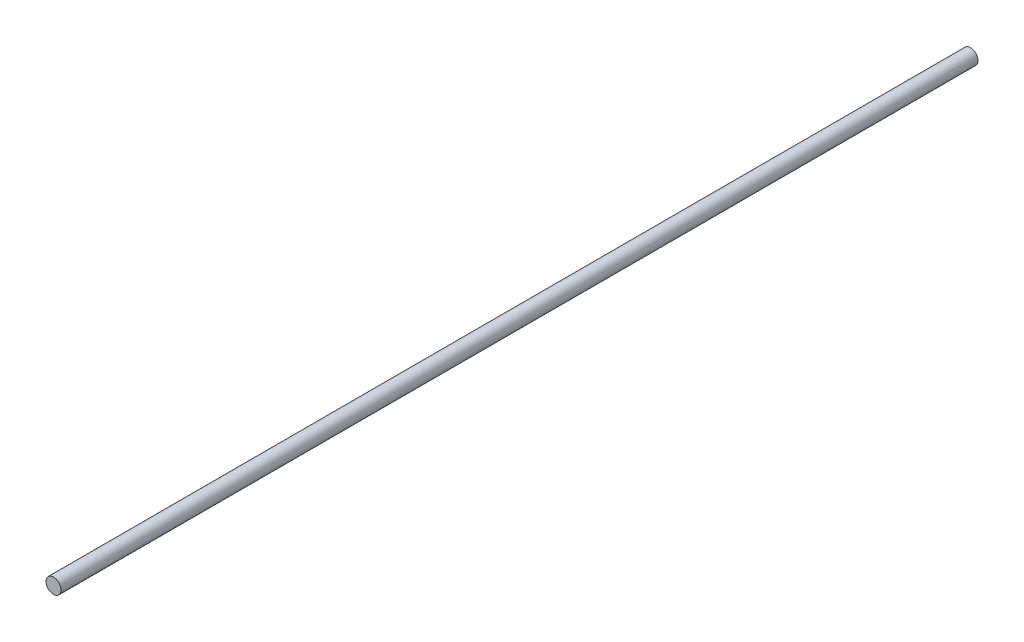
ISO-10303-21;
HEADER;
FILE_DESCRIPTION(('STEP AP214'),'2;1');
FILE_NAME('part.step','',(''),(''),'','','');
FILE_SCHEMA(('AUTOMOTIVE_DESIGN { 1 0 10303 214 1 1 1 1 }'));
ENDSEC;
DATA;
#1=APPLICATION_CONTEXT('core data for automotive mechanical design processes');
#2=APPLICATION_PROTOCOL_DEFINITION('international standard','automotive_design',2000,#1);
#3=PRODUCT_CONTEXT('',#1,'mechanical');
#4=PRODUCT('Part','Part','',(#3));
#5=PRODUCT_RELATED_PRODUCT_CATEGORY('part','',(#4));
#6=PRODUCT_DEFINITION_FORMATION('','',#4);
#7=PRODUCT_DEFINITION_CONTEXT('part definition',#1,'design');
#8=PRODUCT_DEFINITION('design','',#6,#7);
#9=PRODUCT_DEFINITION_SHAPE('','',#8);
#10=(LENGTH_UNIT() NAMED_UNIT(*) SI_UNIT(.MILLI.,.METRE.));
#11=(NAMED_UNIT(*) PLANE_ANGLE_UNIT() SI_UNIT($,.RADIAN.));
#12=(NAMED_UNIT(*) SI_UNIT($,.STERADIAN.) SOLID_ANGLE_UNIT());
#13=UNCERTAINTY_MEASURE_WITH_UNIT(LENGTH_MEASURE(1.E-05),#10,'distance_accuracy_value','');
#14=(GEOMETRIC_REPRESENTATION_CONTEXT(3) GLOBAL_UNCERTAINTY_ASSIGNED_CONTEXT((#13)) GLOBAL_UNIT_ASSIGNED_CONTEXT((#10,
#11,#12)) REPRESENTATION_CONTEXT('',''));
#15=CARTESIAN_POINT('',(0.,0.,0.));
#16=DIRECTION('',(0.,0.,1.));
#17=DIRECTION('',(1.,0.,0.));
#18=AXIS2_PLACEMENT_3D('',#15,#16,#17);
#19=CARTESIAN_POINT('',(0.,0.,-774.7));
#20=DIRECTION('',(0.,0.,1.));
#21=DIRECTION('',(1.,0.,0.));
#22=AXIS2_PLACEMENT_3D('',#19,#20,#21);
#23=CYLINDRICAL_SURFACE('',#22,6.35);
#24=CARTESIAN_POINT('',(0.,0.,-774.7));
#25=DIRECTION('',(0.,0.,1.));
#26=DIRECTION('',(1.,0.,0.));
#27=AXIS2_PLACEMENT_3D('',#24,#25,#26);
#28=CIRCLE('',#27,6.35);
#29=CARTESIAN_POINT('',(6.35,0.,-774.7));
#30=VERTEX_POINT('',#29);
#31=EDGE_CURVE('E10',#30,#30,#28,.T.);
#32=ORIENTED_EDGE('',*,*,#31,.T.);
#33=EDGE_LOOP('',(#32));
#34=FACE_BOUND('',#33,.T.);
#35=CARTESIAN_POINT('',(0.,0.,0.));
#36=DIRECTION('',(0.,0.,1.));
#37=DIRECTION('',(1.,0.,0.));
#38=AXIS2_PLACEMENT_3D('',#35,#36,#37);
#39=CIRCLE('',#38,6.35);
#40=CARTESIAN_POINT('',(6.35,0.,0.));
#41=VERTEX_POINT('',#40);
#42=EDGE_CURVE('E40',#41,#41,#39,.T.);
#43=ORIENTED_EDGE('',*,*,#42,.F.);
#44=EDGE_LOOP('',(#43));
#45=FACE_BOUND('',#44,.T.);
#46=ADVANCED_FACE('F37',(#34,#45),#23,.T.);
#47=CARTESIAN_POINT('',(0.,0.,-774.7));
#48=DIRECTION('',(0.,0.,1.));
#49=DIRECTION('',(1.,0.,0.));
#50=AXIS2_PLACEMENT_3D('',#47,#48,#49);
#51=PLANE('',#50);
#52=ORIENTED_EDGE('',*,*,#31,.F.);
#53=EDGE_LOOP('',(#52));
#54=FACE_BOUND('',#53,.T.);
#55=ADVANCED_FACE('F54',(#54),#51,.F.);
#56=CARTESIAN_POINT('',(0.,0.,0.));
#57=DIRECTION('',(0.,0.,1.));
#58=DIRECTION('',(1.,0.,0.));
#59=AXIS2_PLACEMENT_3D('',#56,#57,#58);
#60=PLANE('',#59);
#61=ORIENTED_EDGE('',*,*,#42,.T.);
#62=EDGE_LOOP('',(#61));
#63=FACE_BOUND('',#62,.T.);
#64=ADVANCED_FACE('F51',(#63),#60,.T.);
#65=CLOSED_SHELL('',(#46,#55,#64));
#66=MANIFOLD_SOLID_BREP('B2',#65);
#67=ADVANCED_BREP_SHAPE_REPRESENTATION('',(#18,#66),#14);
#68=SHAPE_DEFINITION_REPRESENTATION(#9,#67);
ENDSEC;
END-ISO-10303-21;
